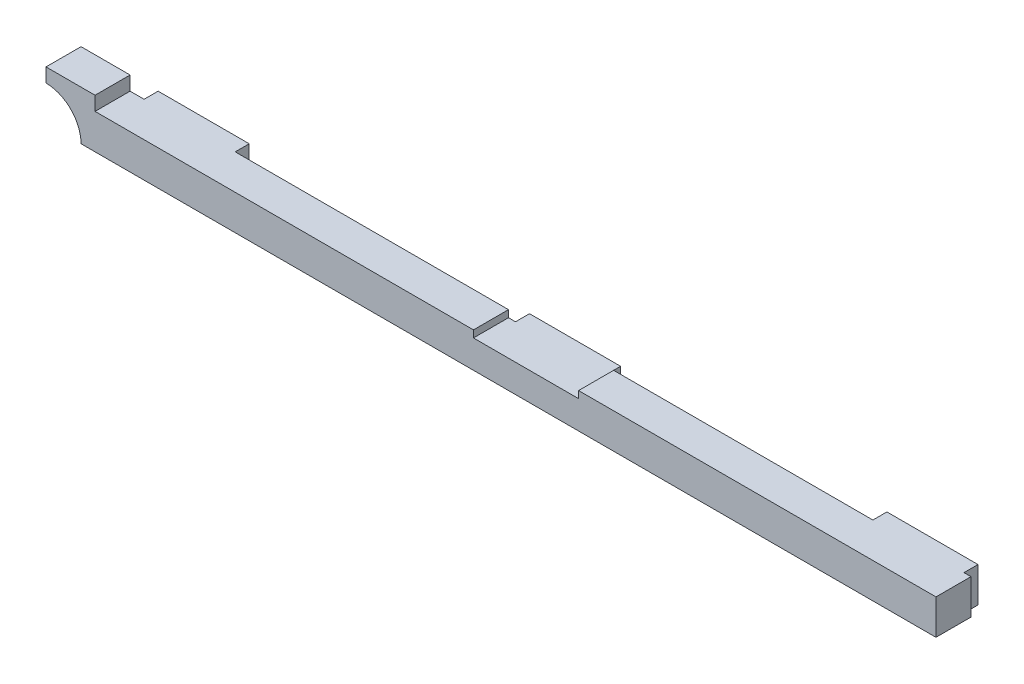
ISO-10303-21;
HEADER;
FILE_DESCRIPTION(('STEP AP214'),'2;1');
FILE_NAME('part.step','',(''),(''),'','','');
FILE_SCHEMA(('AUTOMOTIVE_DESIGN { 1 0 10303 214 1 1 1 1 }'));
ENDSEC;
DATA;
#1=APPLICATION_CONTEXT('core data for automotive mechanical design processes');
#2=APPLICATION_PROTOCOL_DEFINITION('international standard','automotive_design',2000,#1);
#3=PRODUCT_CONTEXT('',#1,'mechanical');
#4=PRODUCT('Part','Part','',(#3));
#5=PRODUCT_RELATED_PRODUCT_CATEGORY('part','',(#4));
#6=PRODUCT_DEFINITION_FORMATION('','',#4);
#7=PRODUCT_DEFINITION_CONTEXT('part definition',#1,'design');
#8=PRODUCT_DEFINITION('design','',#6,#7);
#9=PRODUCT_DEFINITION_SHAPE('','',#8);
#10=(LENGTH_UNIT() NAMED_UNIT(*) SI_UNIT(.MILLI.,.METRE.));
#11=(NAMED_UNIT(*) PLANE_ANGLE_UNIT() SI_UNIT($,.RADIAN.));
#12=(NAMED_UNIT(*) SI_UNIT($,.STERADIAN.) SOLID_ANGLE_UNIT());
#13=UNCERTAINTY_MEASURE_WITH_UNIT(LENGTH_MEASURE(1.E-05),#10,'distance_accuracy_value','');
#14=(GEOMETRIC_REPRESENTATION_CONTEXT(3) GLOBAL_UNCERTAINTY_ASSIGNED_CONTEXT((#13)) GLOBAL_UNIT_ASSIGNED_CONTEXT((#10,
#11,#12)) REPRESENTATION_CONTEXT('',''));
#15=CARTESIAN_POINT('',(0.,0.,0.));
#16=DIRECTION('',(0.,0.,1.));
#17=DIRECTION('',(1.,0.,0.));
#18=AXIS2_PLACEMENT_3D('',#15,#16,#17);
#19=CARTESIAN_POINT('',(-61.,-4.00000000000002,0.));
#20=DIRECTION('',(0.,0.,1.));
#21=DIRECTION('',(1.,0.,0.));
#22=AXIS2_PLACEMENT_3D('',#19,#20,#21);
#23=PLANE('',#22);
#24=DIRECTION('',(0.,-1.,0.));
#25=VECTOR('',#24,1.);
#26=CARTESIAN_POINT('',(-39.,1.,0.));
#27=LINE('',#26,#25);
#28=CARTESIAN_POINT('',(-39.,0.999999999999995,0.));
#29=VERTEX_POINT('',#28);
#30=CARTESIAN_POINT('',(-39.,-4.00000000000001,0.));
#31=VERTEX_POINT('',#30);
#32=EDGE_CURVE('E65',#29,#31,#27,.T.);
#33=ORIENTED_EDGE('',*,*,#32,.F.);
#34=DIRECTION('',(-1.,0.,0.));
#35=VECTOR('',#34,1.);
#36=CARTESIAN_POINT('',(0.,1.,0.));
#37=LINE('',#36,#35);
#38=CARTESIAN_POINT('',(0.,1.,0.));
#39=VERTEX_POINT('',#38);
#40=EDGE_CURVE('E368',#39,#29,#37,.T.);
#41=ORIENTED_EDGE('',*,*,#40,.F.);
#42=DIRECTION('',(0.,1.,0.));
#43=VECTOR('',#42,1.);
#44=CARTESIAN_POINT('',(0.,0.,0.));
#45=LINE('',#44,#43);
#46=CARTESIAN_POINT('',(0.,0.,0.));
#47=VERTEX_POINT('',#46);
#48=EDGE_CURVE('E371',#47,#39,#45,.T.);
#49=ORIENTED_EDGE('',*,*,#48,.F.);
#50=DIRECTION('',(1.,0.,0.));
#51=VECTOR('',#50,1.);
#52=CARTESIAN_POINT('',(0.,0.,0.));
#53=LINE('',#52,#51);
#54=CARTESIAN_POINT('',(0.999999999999999,0.,0.));
#55=VERTEX_POINT('',#54);
#56=EDGE_CURVE('E375',#47,#55,#53,.T.);
#57=ORIENTED_EDGE('',*,*,#56,.T.);
#58=DIRECTION('',(0.,1.,0.));
#59=VECTOR('',#58,1.);
#60=CARTESIAN_POINT('',(0.999999999999999,0.,0.));
#61=LINE('',#60,#59);
#62=CARTESIAN_POINT('',(0.999999999999999,-4.,0.));
#63=VERTEX_POINT('',#62);
#64=EDGE_CURVE('E230',#63,#55,#61,.T.);
#65=ORIENTED_EDGE('',*,*,#64,.F.);
#66=DIRECTION('',(-1.,0.,0.));
#67=VECTOR('',#66,1.);
#68=CARTESIAN_POINT('',(66.,-4.,0.));
#69=LINE('',#68,#67);
#70=EDGE_CURVE('E443',#63,#31,#69,.T.);
#71=ORIENTED_EDGE('',*,*,#70,.T.);
#72=EDGE_LOOP('',(#33,#41,#49,#57,#65,#71));
#73=FACE_BOUND('',#72,.T.);
#74=ADVANCED_FACE('F39',(#73),#23,.F.);
#75=DIRECTION('',(0.,1.,0.));
#76=VECTOR('',#75,1.);
#77=CARTESIAN_POINT('',(-52.,1.,0.));
#78=LINE('',#77,#76);
#79=CARTESIAN_POINT('',(-52.,-4.,0.));
#80=VERTEX_POINT('',#79);
#81=CARTESIAN_POINT('',(-52.,0.999999999999994,0.));
#82=VERTEX_POINT('',#81);
#83=EDGE_CURVE('E221',#80,#82,#78,.T.);
#84=ORIENTED_EDGE('',*,*,#83,.F.);
#85=CARTESIAN_POINT('',(-56.,-4.00000000000002,0.));
#86=VERTEX_POINT('',#85);
#87=EDGE_CURVE('E349',#80,#86,#69,.T.);
#88=ORIENTED_EDGE('',*,*,#87,.T.);
#89=CARTESIAN_POINT('',(-61.,-4.00000000000002,0.));
#90=DIRECTION('',(0.,0.,1.));
#91=DIRECTION('',(1.,0.,0.));
#92=AXIS2_PLACEMENT_3D('',#89,#90,#91);
#93=CIRCLE('',#92,5.);
#94=CARTESIAN_POINT('',(-61.,0.999999999999986,0.));
#95=VERTEX_POINT('',#94);
#96=EDGE_CURVE('E353',#86,#95,#93,.T.);
#97=ORIENTED_EDGE('',*,*,#96,.T.);
#98=DIRECTION('',(0.,-1.,0.));
#99=VECTOR('',#98,1.);
#100=CARTESIAN_POINT('',(-61.,2.99999999999999,0.));
#101=LINE('',#100,#99);
#102=CARTESIAN_POINT('',(-61.,2.99999999999999,0.));
#103=VERTEX_POINT('',#102);
#104=EDGE_CURVE('E358',#103,#95,#101,.T.);
#105=ORIENTED_EDGE('',*,*,#104,.F.);
#106=DIRECTION('',(-1.,0.,0.));
#107=VECTOR('',#106,1.);
#108=CARTESIAN_POINT('',(-54.,2.99999999999999,0.));
#109=LINE('',#108,#107);
#110=CARTESIAN_POINT('',(-54.,2.99999999999999,0.));
#111=VERTEX_POINT('',#110);
#112=EDGE_CURVE('E362',#111,#103,#109,.T.);
#113=ORIENTED_EDGE('',*,*,#112,.F.);
#114=DIRECTION('',(0.,1.,0.));
#115=VECTOR('',#114,1.);
#116=CARTESIAN_POINT('',(-54.,0.999999999999993,0.));
#117=LINE('',#116,#115);
#118=CARTESIAN_POINT('',(-54.,0.999999999999993,0.));
#119=VERTEX_POINT('',#118);
#120=EDGE_CURVE('E365',#119,#111,#117,.T.);
#121=ORIENTED_EDGE('',*,*,#120,.F.);
#122=EDGE_CURVE('E57',#82,#119,#37,.T.);
#123=ORIENTED_EDGE('',*,*,#122,.F.);
#124=EDGE_LOOP('',(#84,#88,#97,#105,#113,#121,#123));
#125=FACE_BOUND('',#124,.T.);
#126=ADVANCED_FACE('F440',(#125),#23,.F.);
#127=DIRECTION('',(0.,-1.,0.));
#128=VECTOR('',#127,1.);
#129=CARTESIAN_POINT('',(14.,0.,0.));
#130=LINE('',#129,#128);
#131=CARTESIAN_POINT('',(14.,0.,0.));
#132=VERTEX_POINT('',#131);
#133=CARTESIAN_POINT('',(14.,-4.00000000000001,0.));
#134=VERTEX_POINT('',#133);
#135=EDGE_CURVE('E225',#132,#134,#130,.T.);
#136=ORIENTED_EDGE('',*,*,#135,.F.);
#137=CARTESIAN_POINT('',(15.,0.,0.));
#138=VERTEX_POINT('',#137);
#139=EDGE_CURVE('E374',#132,#138,#53,.T.);
#140=ORIENTED_EDGE('',*,*,#139,.T.);
#141=DIRECTION('',(0.,1.,0.));
#142=VECTOR('',#141,1.);
#143=CARTESIAN_POINT('',(15.,0.,0.));
#144=LINE('',#143,#142);
#145=CARTESIAN_POINT('',(15.,1.,0.));
#146=VERTEX_POINT('',#145);
#147=EDGE_CURVE('E378',#138,#146,#144,.T.);
#148=ORIENTED_EDGE('',*,*,#147,.T.);
#149=DIRECTION('',(1.,0.,0.));
#150=VECTOR('',#149,1.);
#151=CARTESIAN_POINT('',(15.,1.,0.));
#152=LINE('',#151,#150);
#153=CARTESIAN_POINT('',(52.,1.,0.));
#154=VERTEX_POINT('',#153);
#155=EDGE_CURVE('E311',#146,#154,#152,.T.);
#156=ORIENTED_EDGE('',*,*,#155,.T.);
#157=DIRECTION('',(0.,1.,0.));
#158=VECTOR('',#157,1.);
#159=CARTESIAN_POINT('',(52.,1.,0.));
#160=LINE('',#159,#158);
#161=CARTESIAN_POINT('',(52.,-4.,0.));
#162=VERTEX_POINT('',#161);
#163=EDGE_CURVE('E274',#162,#154,#160,.T.);
#164=ORIENTED_EDGE('',*,*,#163,.F.);
#165=EDGE_CURVE('E354',#162,#134,#69,.T.);
#166=ORIENTED_EDGE('',*,*,#165,.T.);
#167=EDGE_LOOP('',(#136,#140,#148,#156,#164,#166));
#168=FACE_BOUND('',#167,.T.);
#169=ADVANCED_FACE('F449',(#168),#23,.F.);
#170=DIRECTION('',(0.,-1.,0.));
#171=VECTOR('',#170,1.);
#172=CARTESIAN_POINT('',(65.,1.,0.));
#173=LINE('',#172,#171);
#174=CARTESIAN_POINT('',(65.,1.,0.));
#175=VERTEX_POINT('',#174);
#176=CARTESIAN_POINT('',(65.,-4.,0.));
#177=VERTEX_POINT('',#176);
#178=EDGE_CURVE('E268',#175,#177,#173,.T.);
#179=ORIENTED_EDGE('',*,*,#178,.F.);
#180=CARTESIAN_POINT('',(66.,1.,0.));
#181=VERTEX_POINT('',#180);
#182=EDGE_CURVE('E382',#175,#181,#152,.T.);
#183=ORIENTED_EDGE('',*,*,#182,.T.);
#184=DIRECTION('',(0.,-1.,0.));
#185=VECTOR('',#184,1.);
#186=CARTESIAN_POINT('',(66.,1.,0.));
#187=LINE('',#186,#185);
#188=CARTESIAN_POINT('',(66.,-4.,0.));
#189=VERTEX_POINT('',#188);
#190=EDGE_CURVE('E305',#181,#189,#187,.T.);
#191=ORIENTED_EDGE('',*,*,#190,.T.);
#192=EDGE_CURVE('E350',#189,#177,#69,.T.);
#193=ORIENTED_EDGE('',*,*,#192,.T.);
#194=EDGE_LOOP('',(#179,#183,#191,#193));
#195=FACE_BOUND('',#194,.T.);
#196=ADVANCED_FACE('F423',(#195),#23,.F.);
#197=CARTESIAN_POINT('',(66.,1.,5.));
#198=DIRECTION('',(1.,0.,0.));
#199=DIRECTION('',(0.,0.,-1.));
#200=AXIS2_PLACEMENT_3D('',#197,#198,#199);
#201=PLANE('',#200);
#202=ORIENTED_EDGE('',*,*,#190,.F.);
#203=DIRECTION('',(0.,0.,-1.));
#204=VECTOR('',#203,1.);
#205=CARTESIAN_POINT('',(66.,1.,5.));
#206=LINE('',#205,#204);
#207=CARTESIAN_POINT('',(66.,1.,5.));
#208=VERTEX_POINT('',#207);
#209=EDGE_CURVE('E11',#208,#181,#206,.T.);
#210=ORIENTED_EDGE('',*,*,#209,.F.);
#211=DIRECTION('',(0.,-1.,0.));
#212=VECTOR('',#211,1.);
#213=CARTESIAN_POINT('',(66.,1.,5.));
#214=LINE('',#213,#212);
#215=CARTESIAN_POINT('',(66.,-4.,5.));
#216=VERTEX_POINT('',#215);
#217=EDGE_CURVE('E306',#208,#216,#214,.T.);
#218=ORIENTED_EDGE('',*,*,#217,.T.);
#219=DIRECTION('',(0.,0.,-1.));
#220=VECTOR('',#219,1.);
#221=CARTESIAN_POINT('',(66.,-4.,5.));
#222=LINE('',#221,#220);
#223=EDGE_CURVE('E43',#216,#189,#222,.T.);
#224=ORIENTED_EDGE('',*,*,#223,.T.);
#225=EDGE_LOOP('',(#202,#210,#218,#224));
#226=FACE_BOUND('',#225,.T.);
#227=ADVANCED_FACE('F41',(#226),#201,.T.);
#228=CARTESIAN_POINT('',(15.,1.,5.));
#229=DIRECTION('',(0.,1.,0.));
#230=DIRECTION('',(0.,0.,1.));
#231=AXIS2_PLACEMENT_3D('',#228,#229,#230);
#232=PLANE('',#231);
#233=ORIENTED_EDGE('',*,*,#155,.F.);
#234=DIRECTION('',(0.,0.,-1.));
#235=VECTOR('',#234,1.);
#236=CARTESIAN_POINT('',(15.,1.,5.));
#237=LINE('',#236,#235);
#238=CARTESIAN_POINT('',(15.,1.,5.));
#239=VERTEX_POINT('',#238);
#240=EDGE_CURVE('E49',#239,#146,#237,.T.);
#241=ORIENTED_EDGE('',*,*,#240,.F.);
#242=DIRECTION('',(1.,0.,0.));
#243=VECTOR('',#242,1.);
#244=CARTESIAN_POINT('',(15.,1.,5.));
#245=LINE('',#244,#243);
#246=EDGE_CURVE('E342',#239,#208,#245,.T.);
#247=ORIENTED_EDGE('',*,*,#246,.T.);
#248=ORIENTED_EDGE('',*,*,#209,.T.);
#249=ORIENTED_EDGE('',*,*,#182,.F.);
#250=DIRECTION('',(0.,0.,1.));
#251=VECTOR('',#250,1.);
#252=CARTESIAN_POINT('',(65.,1.,-2.));
#253=LINE('',#252,#251);
#254=CARTESIAN_POINT('',(65.,1.,-2.));
#255=VERTEX_POINT('',#254);
#256=EDGE_CURVE('E283',#255,#175,#253,.T.);
#257=ORIENTED_EDGE('',*,*,#256,.F.);
#258=DIRECTION('',(1.,0.,0.));
#259=VECTOR('',#258,1.);
#260=CARTESIAN_POINT('',(65.,1.,-2.));
#261=LINE('',#260,#259);
#262=CARTESIAN_POINT('',(52.,1.,-2.));
#263=VERTEX_POINT('',#262);
#264=EDGE_CURVE('E280',#263,#255,#261,.T.);
#265=ORIENTED_EDGE('',*,*,#264,.F.);
#266=DIRECTION('',(0.,0.,1.));
#267=VECTOR('',#266,1.);
#268=CARTESIAN_POINT('',(52.,1.,-2.));
#269=LINE('',#268,#267);
#270=EDGE_CURVE('E293',#263,#154,#269,.T.);
#271=ORIENTED_EDGE('',*,*,#270,.T.);
#272=EDGE_LOOP('',(#233,#241,#247,#248,#249,#257,#265,#271));
#273=FACE_BOUND('',#272,.T.);
#274=ADVANCED_FACE('F429',(#273),#232,.T.);
#275=CARTESIAN_POINT('',(15.,0.,5.));
#276=DIRECTION('',(-1.,0.,0.));
#277=DIRECTION('',(0.,0.,1.));
#278=AXIS2_PLACEMENT_3D('',#275,#276,#277);
#279=PLANE('',#278);
#280=ORIENTED_EDGE('',*,*,#147,.F.);
#281=DIRECTION('',(0.,0.,-1.));
#282=VECTOR('',#281,1.);
#283=CARTESIAN_POINT('',(15.,0.,5.));
#284=LINE('',#283,#282);
#285=CARTESIAN_POINT('',(15.,0.,5.));
#286=VERTEX_POINT('',#285);
#287=EDGE_CURVE('E387',#286,#138,#284,.T.);
#288=ORIENTED_EDGE('',*,*,#287,.F.);
#289=DIRECTION('',(0.,1.,0.));
#290=VECTOR('',#289,1.);
#291=CARTESIAN_POINT('',(15.,0.,5.));
#292=LINE('',#291,#290);
#293=EDGE_CURVE('E338',#286,#239,#292,.T.);
#294=ORIENTED_EDGE('',*,*,#293,.T.);
#295=ORIENTED_EDGE('',*,*,#240,.T.);
#296=EDGE_LOOP('',(#280,#288,#294,#295));
#297=FACE_BOUND('',#296,.T.);
#298=ADVANCED_FACE('F526',(#297),#279,.T.);
#299=CARTESIAN_POINT('',(0.,0.,5.));
#300=DIRECTION('',(0.,1.,0.));
#301=DIRECTION('',(0.,0.,1.));
#302=AXIS2_PLACEMENT_3D('',#299,#300,#301);
#303=PLANE('',#302);
#304=ORIENTED_EDGE('',*,*,#56,.F.);
#305=DIRECTION('',(0.,0.,-1.));
#306=VECTOR('',#305,1.);
#307=CARTESIAN_POINT('',(0.,0.,5.));
#308=LINE('',#307,#306);
#309=CARTESIAN_POINT('',(0.,0.,5.));
#310=VERTEX_POINT('',#309);
#311=EDGE_CURVE('E391',#310,#47,#308,.T.);
#312=ORIENTED_EDGE('',*,*,#311,.F.);
#313=DIRECTION('',(1.,0.,0.));
#314=VECTOR('',#313,1.);
#315=CARTESIAN_POINT('',(0.,0.,5.));
#316=LINE('',#315,#314);
#317=EDGE_CURVE('E334',#310,#286,#316,.T.);
#318=ORIENTED_EDGE('',*,*,#317,.T.);
#319=ORIENTED_EDGE('',*,*,#287,.T.);
#320=ORIENTED_EDGE('',*,*,#139,.F.);
#321=DIRECTION('',(0.,0.,1.));
#322=VECTOR('',#321,1.);
#323=CARTESIAN_POINT('',(14.,0.,-2.));
#324=LINE('',#323,#322);
#325=CARTESIAN_POINT('',(14.,0.,-2.));
#326=VERTEX_POINT('',#325);
#327=EDGE_CURVE('E248',#326,#132,#324,.T.);
#328=ORIENTED_EDGE('',*,*,#327,.F.);
#329=DIRECTION('',(1.,0.,0.));
#330=VECTOR('',#329,1.);
#331=CARTESIAN_POINT('',(14.,0.,-2.));
#332=LINE('',#331,#330);
#333=CARTESIAN_POINT('',(0.999999999999999,0.,-2.));
#334=VERTEX_POINT('',#333);
#335=EDGE_CURVE('E246',#334,#326,#332,.T.);
#336=ORIENTED_EDGE('',*,*,#335,.F.);
#337=DIRECTION('',(0.,0.,1.));
#338=VECTOR('',#337,1.);
#339=CARTESIAN_POINT('',(0.999999999999999,0.,-2.));
#340=LINE('',#339,#338);
#341=EDGE_CURVE('E256',#334,#55,#340,.T.);
#342=ORIENTED_EDGE('',*,*,#341,.T.);
#343=EDGE_LOOP('',(#304,#312,#318,#319,#320,#328,#336,#342));
#344=FACE_BOUND('',#343,.T.);
#345=ADVANCED_FACE('F461',(#344),#303,.T.);
#346=CARTESIAN_POINT('',(0.,0.,5.));
#347=DIRECTION('',(-1.,0.,0.));
#348=DIRECTION('',(0.,0.,1.));
#349=AXIS2_PLACEMENT_3D('',#346,#347,#348);
#350=PLANE('',#349);
#351=ORIENTED_EDGE('',*,*,#48,.T.);
#352=DIRECTION('',(0.,0.,-1.));
#353=VECTOR('',#352,1.);
#354=CARTESIAN_POINT('',(0.,1.,5.));
#355=LINE('',#354,#353);
#356=CARTESIAN_POINT('',(0.,1.,5.));
#357=VERTEX_POINT('',#356);
#358=EDGE_CURVE('E394',#357,#39,#355,.T.);
#359=ORIENTED_EDGE('',*,*,#358,.F.);
#360=DIRECTION('',(0.,1.,0.));
#361=VECTOR('',#360,1.);
#362=CARTESIAN_POINT('',(0.,0.,5.));
#363=LINE('',#362,#361);
#364=EDGE_CURVE('E331',#310,#357,#363,.T.);
#365=ORIENTED_EDGE('',*,*,#364,.F.);
#366=ORIENTED_EDGE('',*,*,#311,.T.);
#367=EDGE_LOOP('',(#351,#359,#365,#366));
#368=FACE_BOUND('',#367,.T.);
#369=ADVANCED_FACE('F538',(#368),#350,.F.);
#370=CARTESIAN_POINT('',(0.,1.,5.));
#371=DIRECTION('',(0.,-1.,0.));
#372=DIRECTION('',(1.,0.,0.));
#373=AXIS2_PLACEMENT_3D('',#370,#371,#372);
#374=PLANE('',#373);
#375=ORIENTED_EDGE('',*,*,#40,.T.);
#376=DIRECTION('',(0.,0.,1.));
#377=VECTOR('',#376,1.);
#378=CARTESIAN_POINT('',(-39.,1.,-2.));
#379=LINE('',#378,#377);
#380=CARTESIAN_POINT('',(-39.,1.,-2.));
#381=VERTEX_POINT('',#380);
#382=EDGE_CURVE('E720',#381,#29,#379,.T.);
#383=ORIENTED_EDGE('',*,*,#382,.F.);
#384=DIRECTION('',(1.,0.,0.));
#385=VECTOR('',#384,1.);
#386=CARTESIAN_POINT('',(-39.,1.,-2.));
#387=LINE('',#386,#385);
#388=CARTESIAN_POINT('',(-52.,1.,-2.));
#389=VERTEX_POINT('',#388);
#390=EDGE_CURVE('E216',#389,#381,#387,.T.);
#391=ORIENTED_EDGE('',*,*,#390,.F.);
#392=DIRECTION('',(0.,0.,1.));
#393=VECTOR('',#392,1.);
#394=CARTESIAN_POINT('',(-52.,1.,-2.));
#395=LINE('',#394,#393);
#396=EDGE_CURVE('E232',#389,#82,#395,.T.);
#397=ORIENTED_EDGE('',*,*,#396,.T.);
#398=ORIENTED_EDGE('',*,*,#122,.T.);
#399=DIRECTION('',(0.,0.,-1.));
#400=VECTOR('',#399,1.);
#401=CARTESIAN_POINT('',(-54.,0.999999999999993,5.));
#402=LINE('',#401,#400);
#403=CARTESIAN_POINT('',(-54.,0.999999999999993,5.));
#404=VERTEX_POINT('',#403);
#405=EDGE_CURVE('E398',#404,#119,#402,.T.);
#406=ORIENTED_EDGE('',*,*,#405,.F.);
#407=DIRECTION('',(-1.,0.,0.));
#408=VECTOR('',#407,1.);
#409=CARTESIAN_POINT('',(0.,1.,5.));
#410=LINE('',#409,#408);
#411=EDGE_CURVE('E328',#357,#404,#410,.T.);
#412=ORIENTED_EDGE('',*,*,#411,.F.);
#413=ORIENTED_EDGE('',*,*,#358,.T.);
#414=EDGE_LOOP('',(#375,#383,#391,#397,#398,#406,#412,#413));
#415=FACE_BOUND('',#414,.T.);
#416=ADVANCED_FACE('F468',(#415),#374,.F.);
#417=CARTESIAN_POINT('',(-54.,0.999999999999993,5.));
#418=DIRECTION('',(-1.,0.,0.));
#419=DIRECTION('',(0.,0.,1.));
#420=AXIS2_PLACEMENT_3D('',#417,#418,#419);
#421=PLANE('',#420);
#422=ORIENTED_EDGE('',*,*,#120,.T.);
#423=DIRECTION('',(0.,0.,-1.));
#424=VECTOR('',#423,1.);
#425=CARTESIAN_POINT('',(-54.,2.99999999999999,5.));
#426=LINE('',#425,#424);
#427=CARTESIAN_POINT('',(-54.,2.99999999999999,5.));
#428=VERTEX_POINT('',#427);
#429=EDGE_CURVE('E402',#428,#111,#426,.T.);
#430=ORIENTED_EDGE('',*,*,#429,.F.);
#431=DIRECTION('',(0.,1.,0.));
#432=VECTOR('',#431,1.);
#433=CARTESIAN_POINT('',(-54.,0.999999999999993,5.));
#434=LINE('',#433,#432);
#435=EDGE_CURVE('E325',#404,#428,#434,.T.);
#436=ORIENTED_EDGE('',*,*,#435,.F.);
#437=ORIENTED_EDGE('',*,*,#405,.T.);
#438=EDGE_LOOP('',(#422,#430,#436,#437));
#439=FACE_BOUND('',#438,.T.);
#440=ADVANCED_FACE('F473',(#439),#421,.F.);
#441=CARTESIAN_POINT('',(-54.,2.99999999999999,5.));
#442=DIRECTION('',(0.,-1.,0.));
#443=DIRECTION('',(1.,0.,0.));
#444=AXIS2_PLACEMENT_3D('',#441,#442,#443);
#445=PLANE('',#444);
#446=ORIENTED_EDGE('',*,*,#112,.T.);
#447=DIRECTION('',(0.,0.,-1.));
#448=VECTOR('',#447,1.);
#449=CARTESIAN_POINT('',(-61.,2.99999999999999,5.));
#450=LINE('',#449,#448);
#451=CARTESIAN_POINT('',(-61.,2.99999999999999,5.));
#452=VERTEX_POINT('',#451);
#453=EDGE_CURVE('E406',#452,#103,#450,.T.);
#454=ORIENTED_EDGE('',*,*,#453,.F.);
#455=DIRECTION('',(-1.,0.,0.));
#456=VECTOR('',#455,1.);
#457=CARTESIAN_POINT('',(-54.,2.99999999999999,5.));
#458=LINE('',#457,#456);
#459=EDGE_CURVE('E322',#428,#452,#458,.T.);
#460=ORIENTED_EDGE('',*,*,#459,.F.);
#461=ORIENTED_EDGE('',*,*,#429,.T.);
#462=EDGE_LOOP('',(#446,#454,#460,#461));
#463=FACE_BOUND('',#462,.T.);
#464=ADVANCED_FACE('F477',(#463),#445,.F.);
#465=CARTESIAN_POINT('',(-61.,2.99999999999999,5.));
#466=DIRECTION('',(1.,0.,0.));
#467=DIRECTION('',(0.,0.,-1.));
#468=AXIS2_PLACEMENT_3D('',#465,#466,#467);
#469=PLANE('',#468);
#470=ORIENTED_EDGE('',*,*,#104,.T.);
#471=DIRECTION('',(0.,0.,-1.));
#472=VECTOR('',#471,1.);
#473=CARTESIAN_POINT('',(-61.,0.999999999999986,5.));
#474=LINE('',#473,#472);
#475=CARTESIAN_POINT('',(-61.,0.999999999999986,5.));
#476=VERTEX_POINT('',#475);
#477=EDGE_CURVE('E410',#476,#95,#474,.T.);
#478=ORIENTED_EDGE('',*,*,#477,.F.);
#479=DIRECTION('',(0.,-1.,0.));
#480=VECTOR('',#479,1.);
#481=CARTESIAN_POINT('',(-61.,2.99999999999999,5.));
#482=LINE('',#481,#480);
#483=EDGE_CURVE('E319',#452,#476,#482,.T.);
#484=ORIENTED_EDGE('',*,*,#483,.F.);
#485=ORIENTED_EDGE('',*,*,#453,.T.);
#486=EDGE_LOOP('',(#470,#478,#484,#485));
#487=FACE_BOUND('',#486,.T.);
#488=ADVANCED_FACE('F480',(#487),#469,.F.);
#489=CARTESIAN_POINT('',(-61.,-4.00000000000002,5.));
#490=DIRECTION('',(0.,0.,-1.));
#491=DIRECTION('',(-1.,0.,0.));
#492=AXIS2_PLACEMENT_3D('',#489,#490,#491);
#493=CYLINDRICAL_SURFACE('',#492,5.);
#494=ORIENTED_EDGE('',*,*,#96,.F.);
#495=DIRECTION('',(0.,0.,-1.));
#496=VECTOR('',#495,1.);
#497=CARTESIAN_POINT('',(-56.,-4.00000000000002,5.));
#498=LINE('',#497,#496);
#499=CARTESIAN_POINT('',(-56.,-4.00000000000002,5.));
#500=VERTEX_POINT('',#499);
#501=EDGE_CURVE('E412',#500,#86,#498,.T.);
#502=ORIENTED_EDGE('',*,*,#501,.F.);
#503=CARTESIAN_POINT('',(-61.,-4.00000000000002,5.));
#504=DIRECTION('',(0.,0.,1.));
#505=DIRECTION('',(1.,0.,0.));
#506=AXIS2_PLACEMENT_3D('',#503,#504,#505);
#507=CIRCLE('',#506,5.);
#508=EDGE_CURVE('E315',#500,#476,#507,.T.);
#509=ORIENTED_EDGE('',*,*,#508,.T.);
#510=ORIENTED_EDGE('',*,*,#477,.T.);
#511=EDGE_LOOP('',(#494,#502,#509,#510));
#512=FACE_BOUND('',#511,.T.);
#513=ADVANCED_FACE('F438',(#512),#493,.F.);
#514=CARTESIAN_POINT('',(66.,-4.,5.));
#515=DIRECTION('',(0.,-1.,0.));
#516=DIRECTION('',(1.,0.,0.));
#517=AXIS2_PLACEMENT_3D('',#514,#515,#516);
#518=PLANE('',#517);
#519=ORIENTED_EDGE('',*,*,#192,.F.);
#520=ORIENTED_EDGE('',*,*,#223,.F.);
#521=DIRECTION('',(-1.,0.,0.));
#522=VECTOR('',#521,1.);
#523=CARTESIAN_POINT('',(66.,-4.,5.));
#524=LINE('',#523,#522);
#525=EDGE_CURVE('E310',#216,#500,#524,.T.);
#526=ORIENTED_EDGE('',*,*,#525,.T.);
#527=ORIENTED_EDGE('',*,*,#501,.T.);
#528=ORIENTED_EDGE('',*,*,#87,.F.);
#529=DIRECTION('',(0.,0.,1.));
#530=VECTOR('',#529,1.);
#531=CARTESIAN_POINT('',(-52.,-4.,-2.));
#532=LINE('',#531,#530);
#533=CARTESIAN_POINT('',(-52.,-4.,-2.));
#534=VERTEX_POINT('',#533);
#535=EDGE_CURVE('E206',#534,#80,#532,.T.);
#536=ORIENTED_EDGE('',*,*,#535,.F.);
#537=DIRECTION('',(-1.,0.,0.));
#538=VECTOR('',#537,1.);
#539=CARTESIAN_POINT('',(-39.,-4.,-2.));
#540=LINE('',#539,#538);
#541=CARTESIAN_POINT('',(-39.,-4.,-2.));
#542=VERTEX_POINT('',#541);
#543=EDGE_CURVE('E199',#542,#534,#540,.T.);
#544=ORIENTED_EDGE('',*,*,#543,.F.);
#545=DIRECTION('',(0.,0.,1.));
#546=VECTOR('',#545,1.);
#547=CARTESIAN_POINT('',(-39.,-4.,-2.));
#548=LINE('',#547,#546);
#549=EDGE_CURVE('E204',#542,#31,#548,.T.);
#550=ORIENTED_EDGE('',*,*,#549,.T.);
#551=ORIENTED_EDGE('',*,*,#70,.F.);
#552=DIRECTION('',(0.,0.,1.));
#553=VECTOR('',#552,1.);
#554=CARTESIAN_POINT('',(0.999999999999999,-4.,-2.));
#555=LINE('',#554,#553);
#556=CARTESIAN_POINT('',(0.999999999999999,-4.,-2.));
#557=VERTEX_POINT('',#556);
#558=EDGE_CURVE('E260',#557,#63,#555,.T.);
#559=ORIENTED_EDGE('',*,*,#558,.F.);
#560=DIRECTION('',(-1.,0.,0.));
#561=VECTOR('',#560,1.);
#562=CARTESIAN_POINT('',(14.,-4.,-2.));
#563=LINE('',#562,#561);
#564=CARTESIAN_POINT('',(14.,-4.,-2.));
#565=VERTEX_POINT('',#564);
#566=EDGE_CURVE('E240',#565,#557,#563,.T.);
#567=ORIENTED_EDGE('',*,*,#566,.F.);
#568=DIRECTION('',(0.,0.,1.));
#569=VECTOR('',#568,1.);
#570=CARTESIAN_POINT('',(14.,-4.,-2.));
#571=LINE('',#570,#569);
#572=EDGE_CURVE('E264',#565,#134,#571,.T.);
#573=ORIENTED_EDGE('',*,*,#572,.T.);
#574=ORIENTED_EDGE('',*,*,#165,.F.);
#575=DIRECTION('',(0.,0.,1.));
#576=VECTOR('',#575,1.);
#577=CARTESIAN_POINT('',(52.,-4.,-2.));
#578=LINE('',#577,#576);
#579=CARTESIAN_POINT('',(52.,-4.,-2.));
#580=VERTEX_POINT('',#579);
#581=EDGE_CURVE('E297',#580,#162,#578,.T.);
#582=ORIENTED_EDGE('',*,*,#581,.F.);
#583=DIRECTION('',(-1.,0.,0.));
#584=VECTOR('',#583,1.);
#585=CARTESIAN_POINT('',(65.,-4.,-2.));
#586=LINE('',#585,#584);
#587=CARTESIAN_POINT('',(65.,-4.,-2.));
#588=VERTEX_POINT('',#587);
#589=EDGE_CURVE('E273',#588,#580,#586,.T.);
#590=ORIENTED_EDGE('',*,*,#589,.F.);
#591=DIRECTION('',(0.,0.,1.));
#592=VECTOR('',#591,1.);
#593=CARTESIAN_POINT('',(65.,-4.,-2.));
#594=LINE('',#593,#592);
#595=EDGE_CURVE('E301',#588,#177,#594,.T.);
#596=ORIENTED_EDGE('',*,*,#595,.T.);
#597=EDGE_LOOP('',(#519,#520,#526,#527,#528,#536,#544,#550,#551,#559,#567,#573,#574,#582,#590,#596));
#598=FACE_BOUND('',#597,.T.);
#599=ADVANCED_FACE('F202',(#598),#518,.T.);
#600=CARTESIAN_POINT('',(-61.,-4.00000000000002,5.));
#601=DIRECTION('',(0.,0.,1.));
#602=DIRECTION('',(1.,0.,0.));
#603=AXIS2_PLACEMENT_3D('',#600,#601,#602);
#604=PLANE('',#603);
#605=ORIENTED_EDGE('',*,*,#217,.F.);
#606=ORIENTED_EDGE('',*,*,#246,.F.);
#607=ORIENTED_EDGE('',*,*,#293,.F.);
#608=ORIENTED_EDGE('',*,*,#317,.F.);
#609=ORIENTED_EDGE('',*,*,#364,.T.);
#610=ORIENTED_EDGE('',*,*,#411,.T.);
#611=ORIENTED_EDGE('',*,*,#435,.T.);
#612=ORIENTED_EDGE('',*,*,#459,.T.);
#613=ORIENTED_EDGE('',*,*,#483,.T.);
#614=ORIENTED_EDGE('',*,*,#508,.F.);
#615=ORIENTED_EDGE('',*,*,#525,.F.);
#616=EDGE_LOOP('',(#605,#606,#607,#608,#609,#610,#611,#612,#613,#614,#615));
#617=FACE_BOUND('',#616,.T.);
#618=ADVANCED_FACE('F432',(#617),#604,.T.);
#619=CARTESIAN_POINT('',(65.,1.,-2.));
#620=DIRECTION('',(-1.,0.,0.));
#621=DIRECTION('',(0.,0.,1.));
#622=AXIS2_PLACEMENT_3D('',#619,#620,#621);
#623=PLANE('',#622);
#624=ORIENTED_EDGE('',*,*,#178,.T.);
#625=ORIENTED_EDGE('',*,*,#595,.F.);
#626=DIRECTION('',(0.,-1.,0.));
#627=VECTOR('',#626,1.);
#628=CARTESIAN_POINT('',(65.,1.,-2.));
#629=LINE('',#628,#627);
#630=EDGE_CURVE('E269',#255,#588,#629,.T.);
#631=ORIENTED_EDGE('',*,*,#630,.F.);
#632=ORIENTED_EDGE('',*,*,#256,.T.);
#633=EDGE_LOOP('',(#624,#625,#631,#632));
#634=FACE_BOUND('',#633,.T.);
#635=ADVANCED_FACE('F573',(#634),#623,.F.);
#636=CARTESIAN_POINT('',(52.,1.,-2.));
#637=DIRECTION('',(1.,0.,0.));
#638=DIRECTION('',(0.,0.,-1.));
#639=AXIS2_PLACEMENT_3D('',#636,#637,#638);
#640=PLANE('',#639);
#641=ORIENTED_EDGE('',*,*,#163,.T.);
#642=ORIENTED_EDGE('',*,*,#270,.F.);
#643=DIRECTION('',(0.,1.,0.));
#644=VECTOR('',#643,1.);
#645=CARTESIAN_POINT('',(52.,1.,-2.));
#646=LINE('',#645,#644);
#647=EDGE_CURVE('E277',#580,#263,#646,.T.);
#648=ORIENTED_EDGE('',*,*,#647,.F.);
#649=ORIENTED_EDGE('',*,*,#581,.T.);
#650=EDGE_LOOP('',(#641,#642,#648,#649));
#651=FACE_BOUND('',#650,.T.);
#652=ADVANCED_FACE('F578',(#651),#640,.F.);
#653=CARTESIAN_POINT('',(0.,0.,-2.));
#654=DIRECTION('',(0.,0.,-1.));
#655=DIRECTION('',(-1.,0.,0.));
#656=AXIS2_PLACEMENT_3D('',#653,#654,#655);
#657=PLANE('',#656);
#658=ORIENTED_EDGE('',*,*,#630,.T.);
#659=ORIENTED_EDGE('',*,*,#589,.T.);
#660=ORIENTED_EDGE('',*,*,#647,.T.);
#661=ORIENTED_EDGE('',*,*,#264,.T.);
#662=EDGE_LOOP('',(#658,#659,#660,#661));
#663=FACE_BOUND('',#662,.T.);
#664=ADVANCED_FACE('F587',(#663),#657,.T.);
#665=CARTESIAN_POINT('',(14.,0.,-2.));
#666=DIRECTION('',(-1.,0.,0.));
#667=DIRECTION('',(0.,0.,1.));
#668=AXIS2_PLACEMENT_3D('',#665,#666,#667);
#669=PLANE('',#668);
#670=ORIENTED_EDGE('',*,*,#135,.T.);
#671=ORIENTED_EDGE('',*,*,#572,.F.);
#672=DIRECTION('',(0.,-1.,0.));
#673=VECTOR('',#672,1.);
#674=CARTESIAN_POINT('',(14.,0.,-2.));
#675=LINE('',#674,#673);
#676=EDGE_CURVE('E236',#326,#565,#675,.T.);
#677=ORIENTED_EDGE('',*,*,#676,.F.);
#678=ORIENTED_EDGE('',*,*,#327,.T.);
#679=EDGE_LOOP('',(#670,#671,#677,#678));
#680=FACE_BOUND('',#679,.T.);
#681=ADVANCED_FACE('F456',(#680),#669,.F.);
#682=CARTESIAN_POINT('',(0.999999999999999,0.,-2.));
#683=DIRECTION('',(1.,0.,0.));
#684=DIRECTION('',(0.,0.,-1.));
#685=AXIS2_PLACEMENT_3D('',#682,#683,#684);
#686=PLANE('',#685);
#687=ORIENTED_EDGE('',*,*,#64,.T.);
#688=ORIENTED_EDGE('',*,*,#341,.F.);
#689=DIRECTION('',(0.,1.,0.));
#690=VECTOR('',#689,1.);
#691=CARTESIAN_POINT('',(0.999999999999999,0.,-2.));
#692=LINE('',#691,#690);
#693=EDGE_CURVE('E243',#557,#334,#692,.T.);
#694=ORIENTED_EDGE('',*,*,#693,.F.);
#695=ORIENTED_EDGE('',*,*,#558,.T.);
#696=EDGE_LOOP('',(#687,#688,#694,#695));
#697=FACE_BOUND('',#696,.T.);
#698=ADVANCED_FACE('F604',(#697),#686,.F.);
#699=CARTESIAN_POINT('',(0.,0.,-2.));
#700=DIRECTION('',(0.,0.,-1.));
#701=DIRECTION('',(-1.,0.,0.));
#702=AXIS2_PLACEMENT_3D('',#699,#700,#701);
#703=PLANE('',#702);
#704=ORIENTED_EDGE('',*,*,#676,.T.);
#705=ORIENTED_EDGE('',*,*,#566,.T.);
#706=ORIENTED_EDGE('',*,*,#693,.T.);
#707=ORIENTED_EDGE('',*,*,#335,.T.);
#708=EDGE_LOOP('',(#704,#705,#706,#707));
#709=FACE_BOUND('',#708,.T.);
#710=ADVANCED_FACE('F612',(#709),#703,.T.);
#711=CARTESIAN_POINT('',(-39.,1.,-2.));
#712=DIRECTION('',(-1.,0.,0.));
#713=DIRECTION('',(0.,0.,1.));
#714=AXIS2_PLACEMENT_3D('',#711,#712,#713);
#715=PLANE('',#714);
#716=ORIENTED_EDGE('',*,*,#32,.T.);
#717=ORIENTED_EDGE('',*,*,#549,.F.);
#718=DIRECTION('',(0.,-1.,0.));
#719=VECTOR('',#718,1.);
#720=CARTESIAN_POINT('',(-39.,1.,-2.));
#721=LINE('',#720,#719);
#722=EDGE_CURVE('E211',#381,#542,#721,.T.);
#723=ORIENTED_EDGE('',*,*,#722,.F.);
#724=ORIENTED_EDGE('',*,*,#382,.T.);
#725=EDGE_LOOP('',(#716,#717,#723,#724));
#726=FACE_BOUND('',#725,.T.);
#727=ADVANCED_FACE('F223',(#726),#715,.F.);
#728=CARTESIAN_POINT('',(-52.,1.,-2.));
#729=DIRECTION('',(1.,0.,0.));
#730=DIRECTION('',(0.,1.,0.));
#731=AXIS2_PLACEMENT_3D('',#728,#729,#730);
#732=PLANE('',#731);
#733=ORIENTED_EDGE('',*,*,#83,.T.);
#734=ORIENTED_EDGE('',*,*,#396,.F.);
#735=DIRECTION('',(0.,1.,0.));
#736=VECTOR('',#735,1.);
#737=CARTESIAN_POINT('',(-52.,1.,-2.));
#738=LINE('',#737,#736);
#739=EDGE_CURVE('E210',#534,#389,#738,.T.);
#740=ORIENTED_EDGE('',*,*,#739,.F.);
#741=ORIENTED_EDGE('',*,*,#535,.T.);
#742=EDGE_LOOP('',(#733,#734,#740,#741));
#743=FACE_BOUND('',#742,.T.);
#744=ADVANCED_FACE('F629',(#743),#732,.F.);
#745=CARTESIAN_POINT('',(0.,0.,-2.));
#746=DIRECTION('',(0.,0.,-1.));
#747=DIRECTION('',(-1.,0.,0.));
#748=AXIS2_PLACEMENT_3D('',#745,#746,#747);
#749=PLANE('',#748);
#750=ORIENTED_EDGE('',*,*,#722,.T.);
#751=ORIENTED_EDGE('',*,*,#543,.T.);
#752=ORIENTED_EDGE('',*,*,#739,.T.);
#753=ORIENTED_EDGE('',*,*,#390,.T.);
#754=EDGE_LOOP('',(#750,#751,#752,#753));
#755=FACE_BOUND('',#754,.T.);
#756=ADVANCED_FACE('F214',(#755),#749,.T.);
#757=CLOSED_SHELL('',(#74,#126,#169,#196,#227,#274,#298,#345,#369,#416,#440,#464,#488,#513,#599,
#618,#635,#652,#664,#681,#698,#710,#727,#744,#756));
#758=MANIFOLD_SOLID_BREP('B2',#757);
#759=ADVANCED_BREP_SHAPE_REPRESENTATION('',(#18,#758),#14);
#760=SHAPE_DEFINITION_REPRESENTATION(#9,#759);
ENDSEC;
END-ISO-10303-21;
